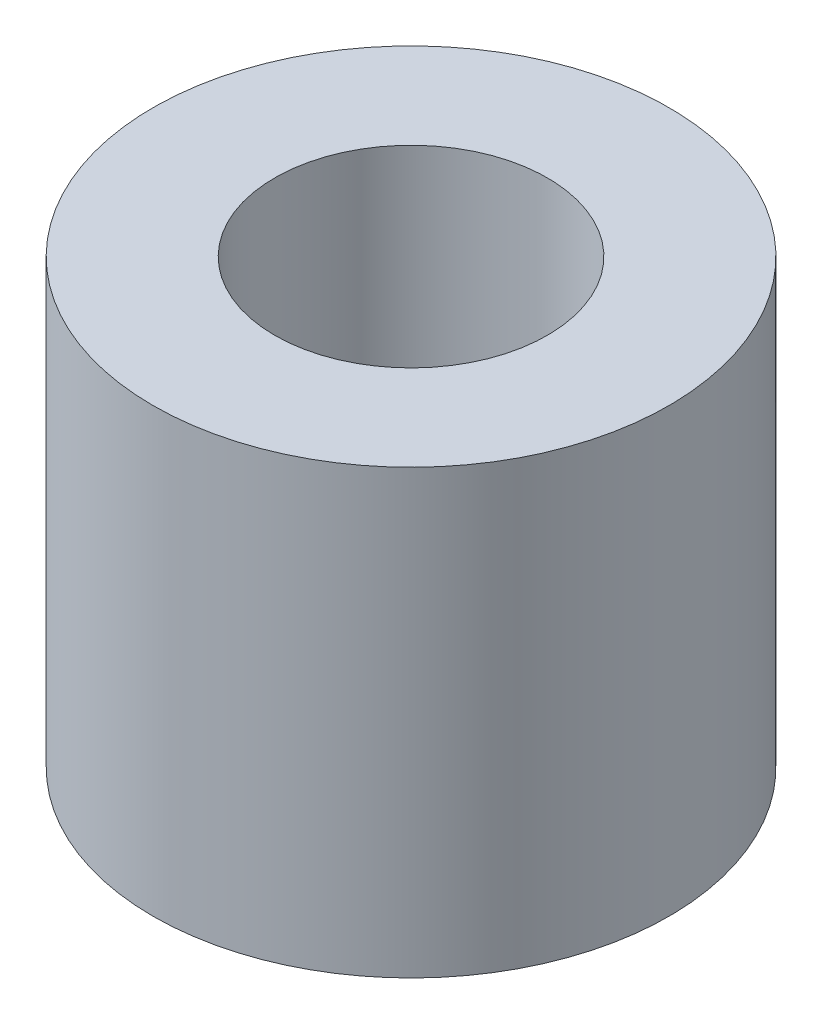
ISO-10303-21;
HEADER;
FILE_DESCRIPTION(('STEP AP214'),'2;1');
FILE_NAME('part.step','',(''),(''),'','','');
FILE_SCHEMA(('AUTOMOTIVE_DESIGN { 1 0 10303 214 1 1 1 1 }'));
ENDSEC;
DATA;
#1=APPLICATION_CONTEXT('core data for automotive mechanical design processes');
#2=APPLICATION_PROTOCOL_DEFINITION('international standard','automotive_design',2000,#1);
#3=PRODUCT_CONTEXT('',#1,'mechanical');
#4=PRODUCT('Part','Part','',(#3));
#5=PRODUCT_RELATED_PRODUCT_CATEGORY('part','',(#4));
#6=PRODUCT_DEFINITION_FORMATION('','',#4);
#7=PRODUCT_DEFINITION_CONTEXT('part definition',#1,'design');
#8=PRODUCT_DEFINITION('design','',#6,#7);
#9=PRODUCT_DEFINITION_SHAPE('','',#8);
#10=(LENGTH_UNIT() NAMED_UNIT(*) SI_UNIT(.MILLI.,.METRE.));
#11=(NAMED_UNIT(*) PLANE_ANGLE_UNIT() SI_UNIT($,.RADIAN.));
#12=(NAMED_UNIT(*) SI_UNIT($,.STERADIAN.) SOLID_ANGLE_UNIT());
#13=UNCERTAINTY_MEASURE_WITH_UNIT(LENGTH_MEASURE(1.E-05),#10,'distance_accuracy_value','');
#14=(GEOMETRIC_REPRESENTATION_CONTEXT(3) GLOBAL_UNCERTAINTY_ASSIGNED_CONTEXT((#13)) GLOBAL_UNIT_ASSIGNED_CONTEXT((#10,
#11,#12)) REPRESENTATION_CONTEXT('',''));
#15=CARTESIAN_POINT('',(0.,0.,0.));
#16=DIRECTION('',(0.,0.,1.));
#17=DIRECTION('',(1.,0.,0.));
#18=AXIS2_PLACEMENT_3D('',#15,#16,#17);
#19=CARTESIAN_POINT('',(0.,6.,0.));
#20=DIRECTION('',(0.,1.,0.));
#21=DIRECTION('',(0.,0.,1.));
#22=AXIS2_PLACEMENT_3D('',#19,#20,#21);
#23=PLANE('',#22);
#24=CARTESIAN_POINT('',(0.,6.,0.));
#25=DIRECTION('',(0.,1.,0.));
#26=DIRECTION('',(0.,0.,1.));
#27=AXIS2_PLACEMENT_3D('',#24,#25,#26);
#28=CIRCLE('',#27,3.5);
#29=CARTESIAN_POINT('',(0.,6.,3.5));
#30=VERTEX_POINT('',#29);
#31=EDGE_CURVE('E10',#30,#30,#28,.T.);
#32=ORIENTED_EDGE('',*,*,#31,.T.);
#33=EDGE_LOOP('',(#32));
#34=FACE_BOUND('',#33,.T.);
#35=CARTESIAN_POINT('',(0.,6.,0.));
#36=DIRECTION('',(0.,1.,0.));
#37=DIRECTION('',(0.,0.,1.));
#38=AXIS2_PLACEMENT_3D('',#35,#36,#37);
#39=CIRCLE('',#38,1.85);
#40=CARTESIAN_POINT('',(0.,6.,1.85));
#41=VERTEX_POINT('',#40);
#42=EDGE_CURVE('E44',#41,#41,#39,.T.);
#43=ORIENTED_EDGE('',*,*,#42,.F.);
#44=EDGE_LOOP('',(#43));
#45=FACE_BOUND('',#44,.T.);
#46=ADVANCED_FACE('F33',(#34,#45),#23,.T.);
#47=CARTESIAN_POINT('',(0.,0.,0.));
#48=DIRECTION('',(0.,1.,0.));
#49=DIRECTION('',(0.,0.,1.));
#50=AXIS2_PLACEMENT_3D('',#47,#48,#49);
#51=PLANE('',#50);
#52=CARTESIAN_POINT('',(0.,0.,0.));
#53=DIRECTION('',(0.,1.,0.));
#54=DIRECTION('',(0.,0.,1.));
#55=AXIS2_PLACEMENT_3D('',#52,#53,#54);
#56=CIRCLE('',#55,3.5);
#57=CARTESIAN_POINT('',(0.,0.,3.5));
#58=VERTEX_POINT('',#57);
#59=EDGE_CURVE('E37',#58,#58,#56,.T.);
#60=ORIENTED_EDGE('',*,*,#59,.F.);
#61=EDGE_LOOP('',(#60));
#62=FACE_BOUND('',#61,.T.);
#63=CARTESIAN_POINT('',(0.,0.,0.));
#64=DIRECTION('',(0.,1.,0.));
#65=DIRECTION('',(0.,0.,1.));
#66=AXIS2_PLACEMENT_3D('',#63,#64,#65);
#67=CIRCLE('',#66,1.85);
#68=CARTESIAN_POINT('',(0.,0.,1.85));
#69=VERTEX_POINT('',#68);
#70=EDGE_CURVE('E46',#69,#69,#67,.T.);
#71=ORIENTED_EDGE('',*,*,#70,.T.);
#72=EDGE_LOOP('',(#71));
#73=FACE_BOUND('',#72,.T.);
#74=ADVANCED_FACE('F56',(#62,#73),#51,.F.);
#75=CARTESIAN_POINT('',(0.,6.,0.));
#76=DIRECTION('',(0.,-1.,0.));
#77=DIRECTION('',(0.,0.,-1.));
#78=AXIS2_PLACEMENT_3D('',#75,#76,#77);
#79=CYLINDRICAL_SURFACE('',#78,3.5);
#80=ORIENTED_EDGE('',*,*,#31,.F.);
#81=EDGE_LOOP('',(#80));
#82=FACE_BOUND('',#81,.T.);
#83=ORIENTED_EDGE('',*,*,#59,.T.);
#84=EDGE_LOOP('',(#83));
#85=FACE_BOUND('',#84,.T.);
#86=ADVANCED_FACE('F35',(#82,#85),#79,.T.);
#87=CARTESIAN_POINT('',(0.,6.,0.));
#88=DIRECTION('',(0.,-1.,0.));
#89=DIRECTION('',(0.,0.,-1.));
#90=AXIS2_PLACEMENT_3D('',#87,#88,#89);
#91=CYLINDRICAL_SURFACE('',#90,1.85);
#92=ORIENTED_EDGE('',*,*,#42,.T.);
#93=EDGE_LOOP('',(#92));
#94=FACE_BOUND('',#93,.T.);
#95=ORIENTED_EDGE('',*,*,#70,.F.);
#96=EDGE_LOOP('',(#95));
#97=FACE_BOUND('',#96,.T.);
#98=ADVANCED_FACE('F52',(#94,#97),#91,.F.);
#99=CLOSED_SHELL('',(#46,#74,#86,#98));
#100=MANIFOLD_SOLID_BREP('B2',#99);
#101=ADVANCED_BREP_SHAPE_REPRESENTATION('',(#18,#100),#14);
#102=SHAPE_DEFINITION_REPRESENTATION(#9,#101);
ENDSEC;
END-ISO-10303-21;
